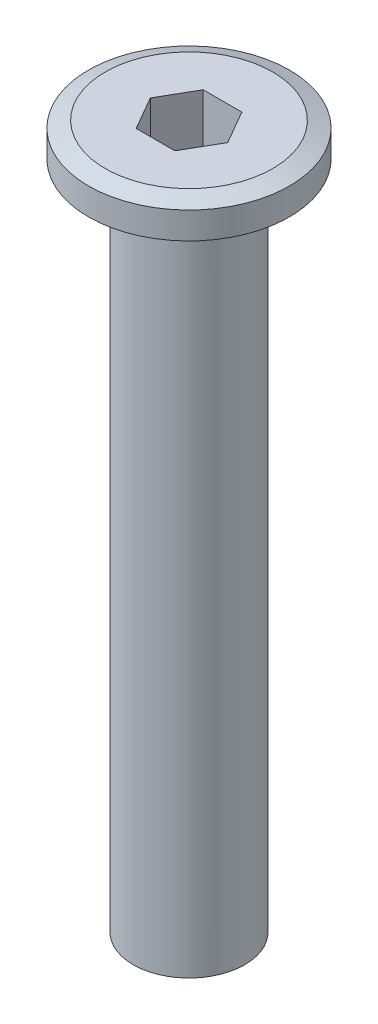
ISO-10303-21;
HEADER;
FILE_DESCRIPTION(('STEP AP214'),'2;1');
FILE_NAME('part.step','',(''),(''),'','','');
FILE_SCHEMA(('AUTOMOTIVE_DESIGN { 1 0 10303 214 1 1 1 1 }'));
ENDSEC;
DATA;
#1=APPLICATION_CONTEXT('core data for automotive mechanical design processes');
#2=APPLICATION_PROTOCOL_DEFINITION('international standard','automotive_design',2000,#1);
#3=PRODUCT_CONTEXT('',#1,'mechanical');
#4=PRODUCT('Part','Part','',(#3));
#5=PRODUCT_RELATED_PRODUCT_CATEGORY('part','',(#4));
#6=PRODUCT_DEFINITION_FORMATION('','',#4);
#7=PRODUCT_DEFINITION_CONTEXT('part definition',#1,'design');
#8=PRODUCT_DEFINITION('design','',#6,#7);
#9=PRODUCT_DEFINITION_SHAPE('','',#8);
#10=(LENGTH_UNIT() NAMED_UNIT(*) SI_UNIT(.MILLI.,.METRE.));
#11=(NAMED_UNIT(*) PLANE_ANGLE_UNIT() SI_UNIT($,.RADIAN.));
#12=(NAMED_UNIT(*) SI_UNIT($,.STERADIAN.) SOLID_ANGLE_UNIT());
#13=UNCERTAINTY_MEASURE_WITH_UNIT(LENGTH_MEASURE(1.E-05),#10,'distance_accuracy_value','');
#14=(GEOMETRIC_REPRESENTATION_CONTEXT(3) GLOBAL_UNCERTAINTY_ASSIGNED_CONTEXT((#13)) GLOBAL_UNIT_ASSIGNED_CONTEXT((#10,
#11,#12)) REPRESENTATION_CONTEXT('',''));
#15=CARTESIAN_POINT('',(0.,0.,0.));
#16=DIRECTION('',(0.,0.,1.));
#17=DIRECTION('',(1.,0.,0.));
#18=AXIS2_PLACEMENT_3D('',#15,#16,#17);
#19=CARTESIAN_POINT('',(0.,1.2,0.));
#20=DIRECTION('',(0.,-1.,0.));
#21=DIRECTION('',(0.,0.,-1.));
#22=AXIS2_PLACEMENT_3D('',#19,#20,#21);
#23=CONICAL_SURFACE('',#22,4.5,1.19028994968253);
#24=CARTESIAN_POINT('',(0.,1.5,0.));
#25=DIRECTION('',(0.,-1.,0.));
#26=DIRECTION('',(0.,0.,-1.));
#27=AXIS2_PLACEMENT_3D('',#24,#25,#26);
#28=CIRCLE('',#27,3.75);
#29=CARTESIAN_POINT('',(0.,1.5,-3.75));
#30=VERTEX_POINT('',#29);
#31=EDGE_CURVE('E146',#30,#30,#28,.T.);
#32=ORIENTED_EDGE('',*,*,#31,.T.);
#33=EDGE_LOOP('',(#32));
#34=FACE_BOUND('',#33,.T.);
#35=CARTESIAN_POINT('',(0.,1.2,0.));
#36=DIRECTION('',(0.,-1.,0.));
#37=DIRECTION('',(0.,0.,-1.));
#38=AXIS2_PLACEMENT_3D('',#35,#36,#37);
#39=CIRCLE('',#38,4.5);
#40=CARTESIAN_POINT('',(0.,1.2,-4.5));
#41=VERTEX_POINT('',#40);
#42=EDGE_CURVE('E44',#41,#41,#39,.T.);
#43=ORIENTED_EDGE('',*,*,#42,.F.);
#44=EDGE_LOOP('',(#43));
#45=FACE_BOUND('',#44,.T.);
#46=ADVANCED_FACE('F37',(#34,#45),#23,.T.);
#47=CARTESIAN_POINT('',(0.,0.,0.));
#48=DIRECTION('',(0.,-1.,0.));
#49=DIRECTION('',(0.,0.,-1.));
#50=AXIS2_PLACEMENT_3D('',#47,#48,#49);
#51=CYLINDRICAL_SURFACE('',#50,4.5);
#52=ORIENTED_EDGE('',*,*,#42,.T.);
#53=EDGE_LOOP('',(#52));
#54=FACE_BOUND('',#53,.T.);
#55=CARTESIAN_POINT('',(0.,0.,0.));
#56=DIRECTION('',(0.,-1.,0.));
#57=DIRECTION('',(0.,0.,-1.));
#58=AXIS2_PLACEMENT_3D('',#55,#56,#57);
#59=CIRCLE('',#58,4.5);
#60=CARTESIAN_POINT('',(0.,0.,-4.5));
#61=VERTEX_POINT('',#60);
#62=EDGE_CURVE('E149',#61,#61,#59,.T.);
#63=ORIENTED_EDGE('',*,*,#62,.F.);
#64=EDGE_LOOP('',(#63));
#65=FACE_BOUND('',#64,.T.);
#66=ADVANCED_FACE('F154',(#54,#65),#51,.T.);
#67=CARTESIAN_POINT('',(0.,0.,0.));
#68=DIRECTION('',(0.,1.,0.));
#69=DIRECTION('',(0.,0.,1.));
#70=AXIS2_PLACEMENT_3D('',#67,#68,#69);
#71=PLANE('',#70);
#72=CARTESIAN_POINT('',(0.,0.,0.));
#73=DIRECTION('',(0.,1.,0.));
#74=DIRECTION('',(0.,0.,1.));
#75=AXIS2_PLACEMENT_3D('',#72,#73,#74);
#76=CIRCLE('',#75,2.5);
#77=CARTESIAN_POINT('',(0.,0.,2.5));
#78=VERTEX_POINT('',#77);
#79=EDGE_CURVE('E11',#78,#78,#76,.F.);
#80=ORIENTED_EDGE('',*,*,#79,.F.);
#81=EDGE_LOOP('',(#80));
#82=FACE_BOUND('',#81,.T.);
#83=ORIENTED_EDGE('',*,*,#62,.T.);
#84=EDGE_LOOP('',(#83));
#85=FACE_BOUND('',#84,.T.);
#86=ADVANCED_FACE('F162',(#82,#85),#71,.F.);
#87=CARTESIAN_POINT('',(0.,1.5,0.));
#88=DIRECTION('',(0.,1.,0.));
#89=DIRECTION('',(0.,0.,1.));
#90=AXIS2_PLACEMENT_3D('',#87,#88,#89);
#91=PLANE('',#90);
#92=DIRECTION('',(0.5,0.,-0.866025403784439));
#93=VECTOR('',#92,1.);
#94=CARTESIAN_POINT('',(0.866025403784439,1.5,1.5));
#95=LINE('',#94,#93);
#96=CARTESIAN_POINT('',(0.866025403784439,1.5,1.5));
#97=VERTEX_POINT('',#96);
#98=CARTESIAN_POINT('',(1.73205080756888,1.5,0.));
#99=VERTEX_POINT('',#98);
#100=EDGE_CURVE('E51',#97,#99,#95,.T.);
#101=ORIENTED_EDGE('',*,*,#100,.F.);
#102=DIRECTION('',(1.,0.,0.));
#103=VECTOR('',#102,1.);
#104=CARTESIAN_POINT('',(-0.866025403784439,1.5,1.5));
#105=LINE('',#104,#103);
#106=CARTESIAN_POINT('',(-0.866025403784439,1.5,1.5));
#107=VERTEX_POINT('',#106);
#108=EDGE_CURVE('E134',#107,#97,#105,.T.);
#109=ORIENTED_EDGE('',*,*,#108,.F.);
#110=DIRECTION('',(0.5,0.,0.866025403784439));
#111=VECTOR('',#110,1.);
#112=CARTESIAN_POINT('',(-1.73205080756888,1.5,0.));
#113=LINE('',#112,#111);
#114=CARTESIAN_POINT('',(-1.73205080756888,1.5,0.));
#115=VERTEX_POINT('',#114);
#116=EDGE_CURVE('E132',#115,#107,#113,.T.);
#117=ORIENTED_EDGE('',*,*,#116,.F.);
#118=DIRECTION('',(-0.5,0.,0.866025403784439));
#119=VECTOR('',#118,1.);
#120=CARTESIAN_POINT('',(-0.866025403784439,1.5,-1.5));
#121=LINE('',#120,#119);
#122=CARTESIAN_POINT('',(-0.866025403784439,1.5,-1.5));
#123=VERTEX_POINT('',#122);
#124=EDGE_CURVE('E99',#123,#115,#121,.T.);
#125=ORIENTED_EDGE('',*,*,#124,.F.);
#126=DIRECTION('',(-1.,0.,0.));
#127=VECTOR('',#126,1.);
#128=CARTESIAN_POINT('',(0.866025403784439,1.5,-1.5));
#129=LINE('',#128,#127);
#130=CARTESIAN_POINT('',(0.866025403784439,1.5,-1.5));
#131=VERTEX_POINT('',#130);
#132=EDGE_CURVE('E128',#131,#123,#129,.T.);
#133=ORIENTED_EDGE('',*,*,#132,.F.);
#134=DIRECTION('',(-0.5,0.,-0.866025403784438));
#135=VECTOR('',#134,1.);
#136=CARTESIAN_POINT('',(1.73205080756888,1.5,0.));
#137=LINE('',#136,#135);
#138=EDGE_CURVE('E125',#99,#131,#137,.T.);
#139=ORIENTED_EDGE('',*,*,#138,.F.);
#140=EDGE_LOOP('',(#101,#109,#117,#125,#133,#139));
#141=FACE_BOUND('',#140,.T.);
#142=ORIENTED_EDGE('',*,*,#31,.F.);
#143=EDGE_LOOP('',(#142));
#144=FACE_BOUND('',#143,.T.);
#145=ADVANCED_FACE('F165',(#141,#144),#91,.T.);
#146=CARTESIAN_POINT('',(0.,-30.,0.));
#147=DIRECTION('',(0.,1.,0.));
#148=DIRECTION('',(0.,0.,1.));
#149=AXIS2_PLACEMENT_3D('',#146,#147,#148);
#150=CYLINDRICAL_SURFACE('',#149,2.5);
#151=CARTESIAN_POINT('',(0.,-30.,0.));
#152=DIRECTION('',(0.,-1.,0.));
#153=DIRECTION('',(0.,0.,-1.));
#154=AXIS2_PLACEMENT_3D('',#151,#152,#153);
#155=CIRCLE('',#154,2.5);
#156=CARTESIAN_POINT('',(0.,-30.,-2.5));
#157=VERTEX_POINT('',#156);
#158=EDGE_CURVE('E138',#157,#157,#155,.T.);
#159=ORIENTED_EDGE('',*,*,#158,.F.);
#160=EDGE_LOOP('',(#159));
#161=FACE_BOUND('',#160,.T.);
#162=ORIENTED_EDGE('',*,*,#79,.T.);
#163=EDGE_LOOP('',(#162));
#164=FACE_BOUND('',#163,.T.);
#165=ADVANCED_FACE('F167',(#161,#164),#150,.T.);
#166=CARTESIAN_POINT('',(0.,-30.,0.));
#167=DIRECTION('',(0.,-1.,0.));
#168=DIRECTION('',(0.,0.,-1.));
#169=AXIS2_PLACEMENT_3D('',#166,#167,#168);
#170=PLANE('',#169);
#171=ORIENTED_EDGE('',*,*,#158,.T.);
#172=EDGE_LOOP('',(#171));
#173=FACE_BOUND('',#172,.T.);
#174=ADVANCED_FACE('F174',(#173),#170,.T.);
#175=CARTESIAN_POINT('',(0.866025403784439,-1.5,1.5));
#176=DIRECTION('',(0.866025403784439,0.,0.5));
#177=DIRECTION('',(0.5,0.,-0.866025403784439));
#178=AXIS2_PLACEMENT_3D('',#175,#176,#177);
#179=PLANE('',#178);
#180=ORIENTED_EDGE('',*,*,#100,.T.);
#181=DIRECTION('',(0.,1.,0.));
#182=VECTOR('',#181,1.);
#183=CARTESIAN_POINT('',(1.73205080756888,-1.5,0.));
#184=LINE('',#183,#182);
#185=CARTESIAN_POINT('',(1.73205080756888,-1.5,0.));
#186=VERTEX_POINT('',#185);
#187=EDGE_CURVE('E81',#186,#99,#184,.T.);
#188=ORIENTED_EDGE('',*,*,#187,.F.);
#189=DIRECTION('',(0.5,0.,-0.866025403784439));
#190=VECTOR('',#189,1.);
#191=CARTESIAN_POINT('',(0.866025403784439,-1.5,1.5));
#192=LINE('',#191,#190);
#193=CARTESIAN_POINT('',(0.866025403784439,-1.5,1.5));
#194=VERTEX_POINT('',#193);
#195=EDGE_CURVE('E136',#194,#186,#192,.T.);
#196=ORIENTED_EDGE('',*,*,#195,.F.);
#197=DIRECTION('',(0.,1.,0.));
#198=VECTOR('',#197,1.);
#199=CARTESIAN_POINT('',(0.866025403784439,-1.5,1.5));
#200=LINE('',#199,#198);
#201=EDGE_CURVE('E59',#194,#97,#200,.T.);
#202=ORIENTED_EDGE('',*,*,#201,.T.);
#203=EDGE_LOOP('',(#180,#188,#196,#202));
#204=FACE_BOUND('',#203,.T.);
#205=ADVANCED_FACE('F182',(#204),#179,.F.);
#206=CARTESIAN_POINT('',(-0.866025403784439,-1.5,1.5));
#207=DIRECTION('',(0.,0.,1.));
#208=DIRECTION('',(1.,0.,0.));
#209=AXIS2_PLACEMENT_3D('',#206,#207,#208);
#210=PLANE('',#209);
#211=ORIENTED_EDGE('',*,*,#108,.T.);
#212=ORIENTED_EDGE('',*,*,#201,.F.);
#213=DIRECTION('',(1.,0.,0.));
#214=VECTOR('',#213,1.);
#215=CARTESIAN_POINT('',(-0.866025403784439,-1.5,1.5));
#216=LINE('',#215,#214);
#217=CARTESIAN_POINT('',(-0.866025403784439,-1.5,1.5));
#218=VERTEX_POINT('',#217);
#219=EDGE_CURVE('E111',#218,#194,#216,.T.);
#220=ORIENTED_EDGE('',*,*,#219,.F.);
#221=DIRECTION('',(0.,1.,0.));
#222=VECTOR('',#221,1.);
#223=CARTESIAN_POINT('',(-0.866025403784439,-1.5,1.5));
#224=LINE('',#223,#222);
#225=EDGE_CURVE('E103',#218,#107,#224,.T.);
#226=ORIENTED_EDGE('',*,*,#225,.T.);
#227=EDGE_LOOP('',(#211,#212,#220,#226));
#228=FACE_BOUND('',#227,.T.);
#229=ADVANCED_FACE('F186',(#228),#210,.F.);
#230=CARTESIAN_POINT('',(-1.73205080756888,-1.5,0.));
#231=DIRECTION('',(-0.866025403784439,0.,0.5));
#232=DIRECTION('',(0.5,0.,0.866025403784439));
#233=AXIS2_PLACEMENT_3D('',#230,#231,#232);
#234=PLANE('',#233);
#235=ORIENTED_EDGE('',*,*,#116,.T.);
#236=ORIENTED_EDGE('',*,*,#225,.F.);
#237=DIRECTION('',(0.5,0.,0.866025403784439));
#238=VECTOR('',#237,1.);
#239=CARTESIAN_POINT('',(-1.73205080756888,-1.5,0.));
#240=LINE('',#239,#238);
#241=CARTESIAN_POINT('',(-1.73205080756888,-1.5,0.));
#242=VERTEX_POINT('',#241);
#243=EDGE_CURVE('E107',#242,#218,#240,.T.);
#244=ORIENTED_EDGE('',*,*,#243,.F.);
#245=DIRECTION('',(0.,1.,0.));
#246=VECTOR('',#245,1.);
#247=CARTESIAN_POINT('',(-1.73205080756888,-1.5,0.));
#248=LINE('',#247,#246);
#249=EDGE_CURVE('E92',#242,#115,#248,.T.);
#250=ORIENTED_EDGE('',*,*,#249,.T.);
#251=EDGE_LOOP('',(#235,#236,#244,#250));
#252=FACE_BOUND('',#251,.T.);
#253=ADVANCED_FACE('F108',(#252),#234,.F.);
#254=CARTESIAN_POINT('',(-0.866025403784439,-1.5,-1.5));
#255=DIRECTION('',(-0.866025403784439,0.,-0.5));
#256=DIRECTION('',(-0.5,0.,0.866025403784439));
#257=AXIS2_PLACEMENT_3D('',#254,#255,#256);
#258=PLANE('',#257);
#259=ORIENTED_EDGE('',*,*,#124,.T.);
#260=ORIENTED_EDGE('',*,*,#249,.F.);
#261=DIRECTION('',(-0.5,0.,0.866025403784439));
#262=VECTOR('',#261,1.);
#263=CARTESIAN_POINT('',(-0.866025403784439,-1.5,-1.5));
#264=LINE('',#263,#262);
#265=CARTESIAN_POINT('',(-0.866025403784439,-1.5,-1.5));
#266=VERTEX_POINT('',#265);
#267=EDGE_CURVE('E96',#266,#242,#264,.T.);
#268=ORIENTED_EDGE('',*,*,#267,.F.);
#269=DIRECTION('',(0.,1.,0.));
#270=VECTOR('',#269,1.);
#271=CARTESIAN_POINT('',(-0.866025403784439,-1.5,-1.5));
#272=LINE('',#271,#270);
#273=EDGE_CURVE('E104',#266,#123,#272,.T.);
#274=ORIENTED_EDGE('',*,*,#273,.T.);
#275=EDGE_LOOP('',(#259,#260,#268,#274));
#276=FACE_BOUND('',#275,.T.);
#277=ADVANCED_FACE('F94',(#276),#258,.F.);
#278=CARTESIAN_POINT('',(0.866025403784439,-1.5,-1.5));
#279=DIRECTION('',(0.,0.,-1.));
#280=DIRECTION('',(-1.,0.,0.));
#281=AXIS2_PLACEMENT_3D('',#278,#279,#280);
#282=PLANE('',#281);
#283=ORIENTED_EDGE('',*,*,#132,.T.);
#284=ORIENTED_EDGE('',*,*,#273,.F.);
#285=DIRECTION('',(-1.,0.,0.));
#286=VECTOR('',#285,1.);
#287=CARTESIAN_POINT('',(0.866025403784439,-1.5,-1.5));
#288=LINE('',#287,#286);
#289=CARTESIAN_POINT('',(0.866025403784439,-1.5,-1.5));
#290=VERTEX_POINT('',#289);
#291=EDGE_CURVE('E117',#290,#266,#288,.T.);
#292=ORIENTED_EDGE('',*,*,#291,.F.);
#293=DIRECTION('',(0.,1.,0.));
#294=VECTOR('',#293,1.);
#295=CARTESIAN_POINT('',(0.866025403784439,-1.5,-1.5));
#296=LINE('',#295,#294);
#297=EDGE_CURVE('E141',#290,#131,#296,.T.);
#298=ORIENTED_EDGE('',*,*,#297,.T.);
#299=EDGE_LOOP('',(#283,#284,#292,#298));
#300=FACE_BOUND('',#299,.T.);
#301=ADVANCED_FACE('F190',(#300),#282,.F.);
#302=CARTESIAN_POINT('',(1.73205080756888,-1.5,0.));
#303=DIRECTION('',(0.866025403784439,0.,-0.5));
#304=DIRECTION('',(-0.5,0.,-0.866025403784439));
#305=AXIS2_PLACEMENT_3D('',#302,#303,#304);
#306=PLANE('',#305);
#307=ORIENTED_EDGE('',*,*,#138,.T.);
#308=ORIENTED_EDGE('',*,*,#297,.F.);
#309=DIRECTION('',(-0.5,0.,-0.866025403784438));
#310=VECTOR('',#309,1.);
#311=CARTESIAN_POINT('',(1.73205080756888,-1.5,0.));
#312=LINE('',#311,#310);
#313=EDGE_CURVE('E119',#186,#290,#312,.T.);
#314=ORIENTED_EDGE('',*,*,#313,.F.);
#315=ORIENTED_EDGE('',*,*,#187,.T.);
#316=EDGE_LOOP('',(#307,#308,#314,#315));
#317=FACE_BOUND('',#316,.T.);
#318=ADVANCED_FACE('F187',(#317),#306,.F.);
#319=CARTESIAN_POINT('',(0.,-1.5,0.));
#320=DIRECTION('',(0.,1.,0.));
#321=DIRECTION('',(0.,0.,1.));
#322=AXIS2_PLACEMENT_3D('',#319,#320,#321);
#323=PLANE('',#322);
#324=ORIENTED_EDGE('',*,*,#195,.T.);
#325=ORIENTED_EDGE('',*,*,#313,.T.);
#326=ORIENTED_EDGE('',*,*,#291,.T.);
#327=ORIENTED_EDGE('',*,*,#267,.T.);
#328=ORIENTED_EDGE('',*,*,#243,.T.);
#329=ORIENTED_EDGE('',*,*,#219,.T.);
#330=EDGE_LOOP('',(#324,#325,#326,#327,#328,#329));
#331=FACE_BOUND('',#330,.T.);
#332=ADVANCED_FACE('F114',(#331),#323,.T.);
#333=CLOSED_SHELL('',(#46,#66,#86,#145,#165,#174,#205,#229,#253,#277,#301,#318,#332));
#334=MANIFOLD_SOLID_BREP('B2',#333);
#335=ADVANCED_BREP_SHAPE_REPRESENTATION('',(#18,#334),#14);
#336=SHAPE_DEFINITION_REPRESENTATION(#9,#335);
ENDSEC;
END-ISO-10303-21;
